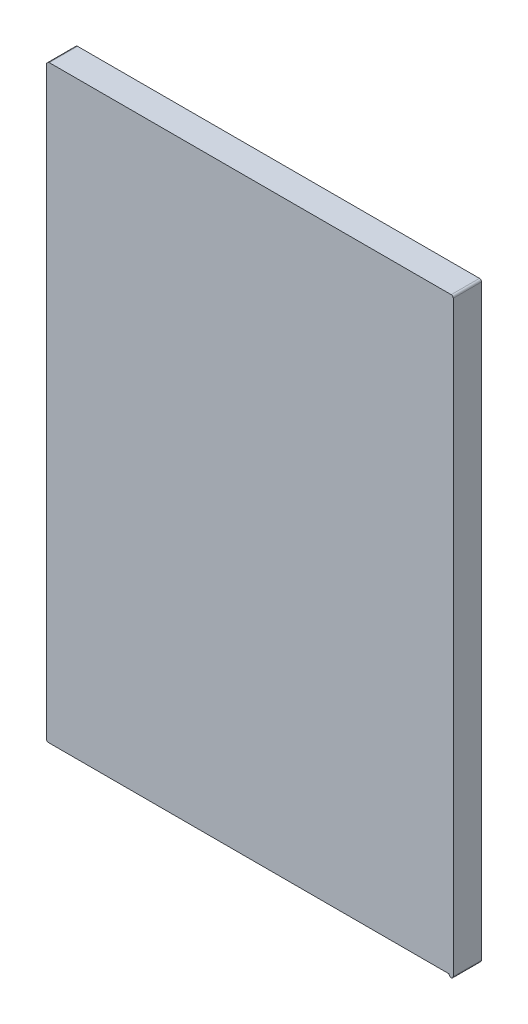
ISO-10303-21;
HEADER;
FILE_DESCRIPTION(('STEP AP214'),'2;1');
FILE_NAME('part.step','',(''),(''),'','','');
FILE_SCHEMA(('AUTOMOTIVE_DESIGN { 1 0 10303 214 1 1 1 1 }'));
ENDSEC;
DATA;
#1=APPLICATION_CONTEXT('core data for automotive mechanical design processes');
#2=APPLICATION_PROTOCOL_DEFINITION('international standard','automotive_design',2000,#1);
#3=PRODUCT_CONTEXT('',#1,'mechanical');
#4=PRODUCT('Part','Part','',(#3));
#5=PRODUCT_RELATED_PRODUCT_CATEGORY('part','',(#4));
#6=PRODUCT_DEFINITION_FORMATION('','',#4);
#7=PRODUCT_DEFINITION_CONTEXT('part definition',#1,'design');
#8=PRODUCT_DEFINITION('design','',#6,#7);
#9=PRODUCT_DEFINITION_SHAPE('','',#8);
#10=(LENGTH_UNIT() NAMED_UNIT(*) SI_UNIT(.MILLI.,.METRE.));
#11=(NAMED_UNIT(*) PLANE_ANGLE_UNIT() SI_UNIT($,.RADIAN.));
#12=(NAMED_UNIT(*) SI_UNIT($,.STERADIAN.) SOLID_ANGLE_UNIT());
#13=UNCERTAINTY_MEASURE_WITH_UNIT(LENGTH_MEASURE(1.E-05),#10,'distance_accuracy_value','');
#14=(GEOMETRIC_REPRESENTATION_CONTEXT(3) GLOBAL_UNCERTAINTY_ASSIGNED_CONTEXT((#13)) GLOBAL_UNIT_ASSIGNED_CONTEXT((#10,
#11,#12)) REPRESENTATION_CONTEXT('',''));
#15=CARTESIAN_POINT('',(0.,0.,0.));
#16=DIRECTION('',(0.,0.,1.));
#17=DIRECTION('',(1.,0.,0.));
#18=AXIS2_PLACEMENT_3D('',#15,#16,#17);
#19=CARTESIAN_POINT('',(82.790769767098,73.419603599632,0.));
#20=DIRECTION('',(0.,0.,-1.));
#21=DIRECTION('',(-1.,0.,0.));
#22=AXIS2_PLACEMENT_3D('',#19,#20,#21);
#23=CYLINDRICAL_SURFACE('',#22,0.127776601566);
#24=DIRECTION('',(0.,0.,-1.));
#25=VECTOR('',#24,1.);
#26=CARTESIAN_POINT('',(82.790792,73.291827,0.));
#27=LINE('',#26,#25);
#28=CARTESIAN_POINT('',(82.790792,73.2918270000001,0.));
#29=VERTEX_POINT('',#28);
#30=CARTESIAN_POINT('',(82.7907919999998,73.2918270000001,1.74244));
#31=VERTEX_POINT('',#30);
#32=EDGE_CURVE('E78',#29,#31,#27,.F.);
#33=ORIENTED_EDGE('',*,*,#32,.F.);
#34=CARTESIAN_POINT('',(82.790769767098,73.419603599632,0.));
#35=DIRECTION('',(0.,0.,-1.));
#36=DIRECTION('',(-1.,0.,0.));
#37=AXIS2_PLACEMENT_3D('',#34,#35,#36);
#38=CIRCLE('',#37,0.127776601566);
#39=CARTESIAN_POINT('',(82.8036189999998,73.2924747000001,0.));
#40=VERTEX_POINT('',#39);
#41=EDGE_CURVE('E20',#29,#40,#38,.F.);
#42=ORIENTED_EDGE('',*,*,#41,.T.);
#43=DIRECTION('',(0.,0.,-1.));
#44=VECTOR('',#43,1.);
#45=CARTESIAN_POINT('',(82.8036189999998,73.2924747,0.));
#46=LINE('',#45,#44);
#47=CARTESIAN_POINT('',(82.8036189999998,73.2924747000001,1.74244));
#48=VERTEX_POINT('',#47);
#49=EDGE_CURVE('E75',#48,#40,#46,.T.);
#50=ORIENTED_EDGE('',*,*,#49,.F.);
#51=CARTESIAN_POINT('',(82.790769767098,73.419603599632,1.74244));
#52=DIRECTION('',(0.,0.,1.));
#53=DIRECTION('',(1.,0.,0.));
#54=AXIS2_PLACEMENT_3D('',#51,#52,#53);
#55=CIRCLE('',#54,0.127776601566);
#56=EDGE_CURVE('E80',#31,#48,#55,.T.);
#57=ORIENTED_EDGE('',*,*,#56,.F.);
#58=EDGE_LOOP('',(#33,#42,#50,#57));
#59=FACE_BOUND('',#58,.T.);
#60=ADVANCED_FACE('F17',(#59),#23,.T.);
#61=CARTESIAN_POINT('',(82.930661553508,73.279338446492,0.));
#62=DIRECTION('',(0.,0.,-1.));
#63=DIRECTION('',(-1.,0.,0.));
#64=AXIS2_PLACEMENT_3D('',#61,#62,#63);
#65=CYLINDRICAL_SURFACE('',#64,0.127719894919);
#66=ORIENTED_EDGE('',*,*,#49,.T.);
#67=CARTESIAN_POINT('',(82.930661553508,73.279338446492,0.));
#68=DIRECTION('',(0.,0.,-1.));
#69=DIRECTION('',(-1.,0.,0.));
#70=AXIS2_PLACEMENT_3D('',#67,#68,#69);
#71=CIRCLE('',#70,0.127719894919);
#72=CARTESIAN_POINT('',(83.0583809999998,73.279,0.));
#73=VERTEX_POINT('',#72);
#74=EDGE_CURVE('E71',#40,#73,#71,.F.);
#75=ORIENTED_EDGE('',*,*,#74,.T.);
#76=DIRECTION('',(0.,0.,-1.));
#77=VECTOR('',#76,1.);
#78=CARTESIAN_POINT('',(83.058381,73.279,0.));
#79=LINE('',#78,#77);
#80=CARTESIAN_POINT('',(83.0583809999998,73.279,1.74244));
#81=VERTEX_POINT('',#80);
#82=EDGE_CURVE('E111',#81,#73,#79,.T.);
#83=ORIENTED_EDGE('',*,*,#82,.F.);
#84=CARTESIAN_POINT('',(82.930661553508,73.279338446492,1.74244));
#85=DIRECTION('',(0.,0.,-1.));
#86=DIRECTION('',(-1.,0.,0.));
#87=AXIS2_PLACEMENT_3D('',#84,#85,#86);
#88=CIRCLE('',#87,0.127719894919);
#89=EDGE_CURVE('E143',#48,#81,#88,.F.);
#90=ORIENTED_EDGE('',*,*,#89,.F.);
#91=EDGE_LOOP('',(#66,#75,#83,#90));
#92=FACE_BOUND('',#91,.T.);
#93=ADVANCED_FACE('F153',(#92),#65,.T.);
#94=CARTESIAN_POINT('',(58.166001222928,109.47400063305,0.));
#95=DIRECTION('',(0.,0.,-1.));
#96=DIRECTION('',(-1.,0.,0.));
#97=AXIS2_PLACEMENT_3D('',#94,#95,#96);
#98=CYLINDRICAL_SURFACE('',#97,0.12738036695);
#99=DIRECTION('',(0.,0.,1.));
#100=VECTOR('',#99,1.);
#101=CARTESIAN_POINT('',(58.166,109.601381,0.));
#102=LINE('',#101,#100);
#103=CARTESIAN_POINT('',(58.166000611464,109.601381,0.));
#104=VERTEX_POINT('',#103);
#105=CARTESIAN_POINT('',(58.166000611464,109.601381,1.74244));
#106=VERTEX_POINT('',#105);
#107=EDGE_CURVE('E108',#104,#106,#102,.T.);
#108=ORIENTED_EDGE('',*,*,#107,.F.);
#109=CARTESIAN_POINT('',(58.166001222928,109.47400063305,0.));
#110=DIRECTION('',(0.,0.,-1.));
#111=DIRECTION('',(-1.,0.,0.));
#112=AXIS2_PLACEMENT_3D('',#109,#110,#111);
#113=CIRCLE('',#112,0.12738036695);
#114=CARTESIAN_POINT('',(58.0562059600022,109.538582039999,0.));
#115=VERTEX_POINT('',#114);
#116=EDGE_CURVE('E150',#104,#115,#113,.F.);
#117=ORIENTED_EDGE('',*,*,#116,.T.);
#118=DIRECTION('',(0.,0.,-1.));
#119=VECTOR('',#118,1.);
#120=CARTESIAN_POINT('',(58.0562059600008,109.538582039999,0.));
#121=LINE('',#120,#119);
#122=CARTESIAN_POINT('',(58.0562059600022,109.538582039999,1.74244));
#123=VERTEX_POINT('',#122);
#124=EDGE_CURVE('E126',#123,#115,#121,.T.);
#125=ORIENTED_EDGE('',*,*,#124,.F.);
#126=CARTESIAN_POINT('',(58.166001222928,109.47400063305,1.74244));
#127=DIRECTION('',(0.,0.,-1.));
#128=DIRECTION('',(-1.,0.,0.));
#129=AXIS2_PLACEMENT_3D('',#126,#127,#128);
#130=CIRCLE('',#129,0.12738036695);
#131=EDGE_CURVE('E137',#106,#123,#130,.F.);
#132=ORIENTED_EDGE('',*,*,#131,.F.);
#133=EDGE_LOOP('',(#108,#117,#125,#132));
#134=FACE_BOUND('',#133,.T.);
#135=ADVANCED_FACE('F196',(#134),#98,.T.);
#136=CARTESIAN_POINT('',(82.930996487018,109.47399648701,0.));
#137=DIRECTION('',(0.,0.,-1.));
#138=DIRECTION('',(-1.,0.,0.));
#139=AXIS2_PLACEMENT_3D('',#136,#137,#138);
#140=CYLINDRICAL_SURFACE('',#139,0.12738451303);
#141=DIRECTION('',(0.,0.,-1.));
#142=VECTOR('',#141,1.);
#143=CARTESIAN_POINT('',(83.058381,109.474,0.));
#144=LINE('',#143,#142);
#145=CARTESIAN_POINT('',(83.058381,109.473998243505,0.));
#146=VERTEX_POINT('',#145);
#147=CARTESIAN_POINT('',(83.058381,109.473998243505,1.74244));
#148=VERTEX_POINT('',#147);
#149=EDGE_CURVE('E115',#146,#148,#144,.F.);
#150=ORIENTED_EDGE('',*,*,#149,.F.);
#151=CARTESIAN_POINT('',(82.930996487018,109.47399648701,0.));
#152=DIRECTION('',(0.,0.,-1.));
#153=DIRECTION('',(-1.,0.,0.));
#154=AXIS2_PLACEMENT_3D('',#151,#152,#153);
#155=CIRCLE('',#154,0.12738451303);
#156=CARTESIAN_POINT('',(82.930998243509,109.601381,0.));
#157=VERTEX_POINT('',#156);
#158=EDGE_CURVE('E148',#146,#157,#155,.F.);
#159=ORIENTED_EDGE('',*,*,#158,.T.);
#160=DIRECTION('',(0.,0.,1.));
#161=VECTOR('',#160,1.);
#162=CARTESIAN_POINT('',(82.931,109.601381,0.));
#163=LINE('',#162,#161);
#164=CARTESIAN_POINT('',(82.930998243509,109.601381,1.74244));
#165=VERTEX_POINT('',#164);
#166=EDGE_CURVE('E104',#165,#157,#163,.F.);
#167=ORIENTED_EDGE('',*,*,#166,.F.);
#168=CARTESIAN_POINT('',(82.930996487018,109.47399648701,1.74244));
#169=DIRECTION('',(0.,0.,-1.));
#170=DIRECTION('',(-1.,0.,0.));
#171=AXIS2_PLACEMENT_3D('',#168,#169,#170);
#172=CIRCLE('',#171,0.12738451303);
#173=EDGE_CURVE('E140',#148,#165,#172,.F.);
#174=ORIENTED_EDGE('',*,*,#173,.F.);
#175=EDGE_LOOP('',(#150,#159,#167,#174));
#176=FACE_BOUND('',#175,.T.);
#177=ADVANCED_FACE('F165',(#176),#140,.T.);
#178=CARTESIAN_POINT('',(58.120791512982,73.419211512982,0.));
#179=DIRECTION('',(0.,0.,-1.));
#180=DIRECTION('',(-1.,0.,0.));
#181=AXIS2_PLACEMENT_3D('',#178,#179,#180);
#182=CYLINDRICAL_SURFACE('',#181,0.12738451303);
#183=DIRECTION('',(0.,0.,1.));
#184=VECTOR('',#183,1.);
#185=CARTESIAN_POINT('',(57.993407,73.419208,0.));
#186=LINE('',#185,#184);
#187=CARTESIAN_POINT('',(57.993407,73.419209756491,0.));
#188=VERTEX_POINT('',#187);
#189=CARTESIAN_POINT('',(57.993407,73.419209756491,1.74244));
#190=VERTEX_POINT('',#189);
#191=EDGE_CURVE('E101',#188,#190,#186,.T.);
#192=ORIENTED_EDGE('',*,*,#191,.F.);
#193=CARTESIAN_POINT('',(58.120791512982,73.419211512982,0.));
#194=DIRECTION('',(0.,0.,-1.));
#195=DIRECTION('',(-1.,0.,0.));
#196=AXIS2_PLACEMENT_3D('',#193,#194,#195);
#197=CIRCLE('',#196,0.12738451303);
#198=CARTESIAN_POINT('',(58.120789756491,73.291827,0.));
#199=VERTEX_POINT('',#198);
#200=EDGE_CURVE('E35',#188,#199,#197,.F.);
#201=ORIENTED_EDGE('',*,*,#200,.T.);
#202=DIRECTION('',(0.,0.,-1.));
#203=VECTOR('',#202,1.);
#204=CARTESIAN_POINT('',(58.120788,73.291827,0.));
#205=LINE('',#204,#203);
#206=CARTESIAN_POINT('',(58.120789756491,73.291827,1.74244));
#207=VERTEX_POINT('',#206);
#208=EDGE_CURVE('E90',#207,#199,#205,.T.);
#209=ORIENTED_EDGE('',*,*,#208,.F.);
#210=CARTESIAN_POINT('',(58.120791512982,73.419211512982,1.74244));
#211=DIRECTION('',(0.,0.,-1.));
#212=DIRECTION('',(-1.,0.,0.));
#213=AXIS2_PLACEMENT_3D('',#210,#211,#212);
#214=CIRCLE('',#213,0.12738451303);
#215=EDGE_CURVE('E134',#190,#207,#214,.F.);
#216=ORIENTED_EDGE('',*,*,#215,.F.);
#217=EDGE_LOOP('',(#192,#201,#209,#216));
#218=FACE_BOUND('',#217,.T.);
#219=ADVANCED_FACE('F255',(#218),#182,.T.);
#220=CARTESIAN_POINT('',(58.120788,73.291827,1.74244));
#221=DIRECTION('',(0.,0.,1.));
#222=DIRECTION('',(1.,0.,0.));
#223=AXIS2_PLACEMENT_3D('',#220,#221,#222);
#224=PLANE('',#223);
#225=DIRECTION('',(0.,1.,0.));
#226=VECTOR('',#225,1.);
#227=CARTESIAN_POINT('',(57.993407,73.419208,1.74244));
#228=LINE('',#227,#226);
#229=CARTESIAN_POINT('',(57.993407,109.428787388535,1.74244));
#230=VERTEX_POINT('',#229);
#231=EDGE_CURVE('E97',#190,#230,#228,.T.);
#232=ORIENTED_EDGE('',*,*,#231,.F.);
#233=ORIENTED_EDGE('',*,*,#215,.T.);
#234=DIRECTION('',(1.,0.,0.));
#235=VECTOR('',#234,1.);
#236=CARTESIAN_POINT('',(82.790792,73.291827,1.74244));
#237=LINE('',#236,#235);
#238=EDGE_CURVE('E84',#31,#207,#237,.F.);
#239=ORIENTED_EDGE('',*,*,#238,.F.);
#240=ORIENTED_EDGE('',*,*,#56,.T.);
#241=ORIENTED_EDGE('',*,*,#89,.T.);
#242=DIRECTION('',(0.,1.,0.));
#243=VECTOR('',#242,1.);
#244=CARTESIAN_POINT('',(83.058381,109.474,1.74244));
#245=LINE('',#244,#243);
#246=EDGE_CURVE('E114',#148,#81,#245,.F.);
#247=ORIENTED_EDGE('',*,*,#246,.F.);
#248=ORIENTED_EDGE('',*,*,#173,.T.);
#249=DIRECTION('',(1.,0.,0.));
#250=VECTOR('',#249,1.);
#251=CARTESIAN_POINT('',(58.166,109.601381,1.74244));
#252=LINE('',#251,#250);
#253=EDGE_CURVE('E107',#106,#165,#252,.T.);
#254=ORIENTED_EDGE('',*,*,#253,.F.);
#255=ORIENTED_EDGE('',*,*,#131,.T.);
#256=CARTESIAN_POINT('',(58.120787366944,109.42878677707,1.74244));
#257=DIRECTION('',(0.,0.,-1.));
#258=DIRECTION('',(-1.,0.,0.));
#259=AXIS2_PLACEMENT_3D('',#256,#257,#258);
#260=CIRCLE('',#259,0.12738036695);
#261=EDGE_CURVE('E129',#230,#123,#260,.T.);
#262=ORIENTED_EDGE('',*,*,#261,.F.);
#263=EDGE_LOOP('',(#232,#233,#239,#240,#241,#247,#248,#254,#255,#262));
#264=FACE_BOUND('',#263,.T.);
#265=ADVANCED_FACE('F190',(#264),#224,.T.);
#266=CARTESIAN_POINT('',(58.120787366944,109.42878677707,0.));
#267=DIRECTION('',(0.,0.,-1.));
#268=DIRECTION('',(-1.,0.,0.));
#269=AXIS2_PLACEMENT_3D('',#266,#267,#268);
#270=CYLINDRICAL_SURFACE('',#269,0.12738036695);
#271=ORIENTED_EDGE('',*,*,#124,.T.);
#272=CARTESIAN_POINT('',(58.120787366944,109.42878677707,0.));
#273=DIRECTION('',(0.,0.,-1.));
#274=DIRECTION('',(-1.,0.,0.));
#275=AXIS2_PLACEMENT_3D('',#272,#273,#274);
#276=CIRCLE('',#275,0.12738036695);
#277=CARTESIAN_POINT('',(57.993407,109.428787388535,0.));
#278=VERTEX_POINT('',#277);
#279=EDGE_CURVE('E85',#115,#278,#276,.F.);
#280=ORIENTED_EDGE('',*,*,#279,.T.);
#281=DIRECTION('',(0.,0.,1.));
#282=VECTOR('',#281,1.);
#283=CARTESIAN_POINT('',(57.993407,109.428788,0.));
#284=LINE('',#283,#282);
#285=EDGE_CURVE('E92',#230,#278,#284,.F.);
#286=ORIENTED_EDGE('',*,*,#285,.F.);
#287=ORIENTED_EDGE('',*,*,#261,.T.);
#288=EDGE_LOOP('',(#271,#280,#286,#287));
#289=FACE_BOUND('',#288,.T.);
#290=ADVANCED_FACE('F193',(#289),#270,.T.);
#291=CARTESIAN_POINT('',(82.790792,73.291827,0.));
#292=DIRECTION('',(0.,-1.,0.));
#293=DIRECTION('',(0.,0.,-1.));
#294=AXIS2_PLACEMENT_3D('',#291,#292,#293);
#295=PLANE('',#294);
#296=ORIENTED_EDGE('',*,*,#208,.T.);
#297=DIRECTION('',(1.,0.,0.));
#298=VECTOR('',#297,1.);
#299=CARTESIAN_POINT('',(58.120788,73.291827,0.));
#300=LINE('',#299,#298);
#301=EDGE_CURVE('E69',#199,#29,#300,.T.);
#302=ORIENTED_EDGE('',*,*,#301,.T.);
#303=ORIENTED_EDGE('',*,*,#32,.T.);
#304=ORIENTED_EDGE('',*,*,#238,.T.);
#305=EDGE_LOOP('',(#296,#302,#303,#304));
#306=FACE_BOUND('',#305,.T.);
#307=ADVANCED_FACE('F88',(#306),#295,.T.);
#308=CARTESIAN_POINT('',(83.058381,109.474,0.));
#309=DIRECTION('',(1.,0.,0.));
#310=DIRECTION('',(0.,0.,-1.));
#311=AXIS2_PLACEMENT_3D('',#308,#309,#310);
#312=PLANE('',#311);
#313=ORIENTED_EDGE('',*,*,#82,.T.);
#314=DIRECTION('',(0.,1.,0.));
#315=VECTOR('',#314,1.);
#316=CARTESIAN_POINT('',(83.058381,73.291827,0.));
#317=LINE('',#316,#315);
#318=EDGE_CURVE('E91',#73,#146,#317,.T.);
#319=ORIENTED_EDGE('',*,*,#318,.T.);
#320=ORIENTED_EDGE('',*,*,#149,.T.);
#321=ORIENTED_EDGE('',*,*,#246,.T.);
#322=EDGE_LOOP('',(#313,#319,#320,#321));
#323=FACE_BOUND('',#322,.T.);
#324=ADVANCED_FACE('F157',(#323),#312,.T.);
#325=CARTESIAN_POINT('',(58.166,109.601381,0.));
#326=DIRECTION('',(0.,1.,0.));
#327=DIRECTION('',(0.,0.,1.));
#328=AXIS2_PLACEMENT_3D('',#325,#326,#327);
#329=PLANE('',#328);
#330=ORIENTED_EDGE('',*,*,#166,.T.);
#331=DIRECTION('',(1.,0.,0.));
#332=VECTOR('',#331,1.);
#333=CARTESIAN_POINT('',(58.120788,109.601381,0.));
#334=LINE('',#333,#332);
#335=EDGE_CURVE('E26',#157,#104,#334,.F.);
#336=ORIENTED_EDGE('',*,*,#335,.T.);
#337=ORIENTED_EDGE('',*,*,#107,.T.);
#338=ORIENTED_EDGE('',*,*,#253,.T.);
#339=EDGE_LOOP('',(#330,#336,#337,#338));
#340=FACE_BOUND('',#339,.T.);
#341=ADVANCED_FACE('F197',(#340),#329,.T.);
#342=CARTESIAN_POINT('',(57.993407,73.419208,0.));
#343=DIRECTION('',(-1.,0.,0.));
#344=DIRECTION('',(0.,0.,1.));
#345=AXIS2_PLACEMENT_3D('',#342,#343,#344);
#346=PLANE('',#345);
#347=ORIENTED_EDGE('',*,*,#285,.T.);
#348=DIRECTION('',(0.,1.,0.));
#349=VECTOR('',#348,1.);
#350=CARTESIAN_POINT('',(57.993407,73.291827,0.));
#351=LINE('',#350,#349);
#352=EDGE_CURVE('E11',#278,#188,#351,.F.);
#353=ORIENTED_EDGE('',*,*,#352,.T.);
#354=ORIENTED_EDGE('',*,*,#191,.T.);
#355=ORIENTED_EDGE('',*,*,#231,.T.);
#356=EDGE_LOOP('',(#347,#353,#354,#355));
#357=FACE_BOUND('',#356,.T.);
#358=ADVANCED_FACE('F187',(#357),#346,.T.);
#359=CARTESIAN_POINT('',(58.120788,73.291827,0.));
#360=DIRECTION('',(0.,0.,1.));
#361=DIRECTION('',(1.,0.,0.));
#362=AXIS2_PLACEMENT_3D('',#359,#360,#361);
#363=PLANE('',#362);
#364=ORIENTED_EDGE('',*,*,#352,.F.);
#365=ORIENTED_EDGE('',*,*,#279,.F.);
#366=ORIENTED_EDGE('',*,*,#116,.F.);
#367=ORIENTED_EDGE('',*,*,#335,.F.);
#368=ORIENTED_EDGE('',*,*,#158,.F.);
#369=ORIENTED_EDGE('',*,*,#318,.F.);
#370=ORIENTED_EDGE('',*,*,#74,.F.);
#371=ORIENTED_EDGE('',*,*,#41,.F.);
#372=ORIENTED_EDGE('',*,*,#301,.F.);
#373=ORIENTED_EDGE('',*,*,#200,.F.);
#374=EDGE_LOOP('',(#364,#365,#366,#367,#368,#369,#370,#371,#372,#373));
#375=FACE_BOUND('',#374,.T.);
#376=ADVANCED_FACE('F67',(#375),#363,.F.);
#377=CLOSED_SHELL('',(#60,#93,#135,#177,#219,#265,#290,#307,#324,#341,#358,#376));
#378=MANIFOLD_SOLID_BREP('B1',#377);
#379=ADVANCED_BREP_SHAPE_REPRESENTATION('',(#18,#378),#14);
#380=SHAPE_DEFINITION_REPRESENTATION(#9,#379);
ENDSEC;
END-ISO-10303-21;
